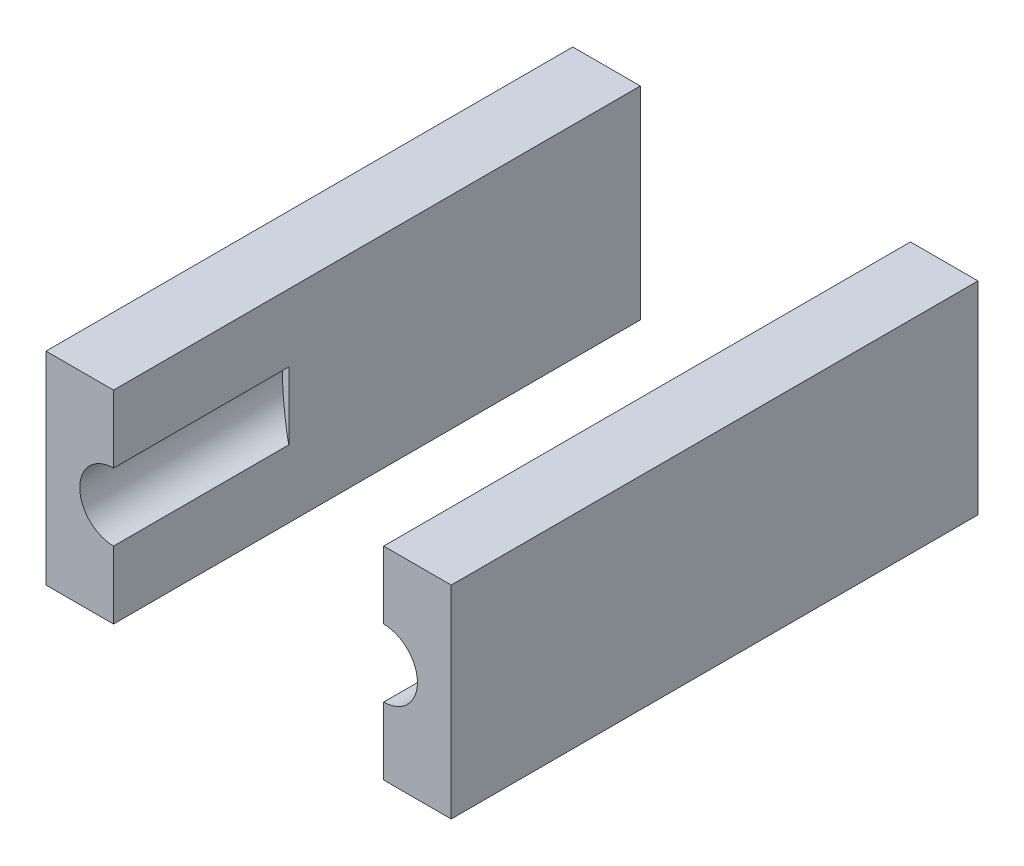
ISO-10303-21;
HEADER;
FILE_DESCRIPTION(('STEP AP214'),'2;1');
FILE_NAME('part.step','',(''),(''),'','','');
FILE_SCHEMA(('AUTOMOTIVE_DESIGN { 1 0 10303 214 1 1 1 1 }'));
ENDSEC;
DATA;
#1=APPLICATION_CONTEXT('core data for automotive mechanical design processes');
#2=APPLICATION_PROTOCOL_DEFINITION('international standard','automotive_design',2000,#1);
#3=PRODUCT_CONTEXT('',#1,'mechanical');
#4=PRODUCT('Part','Part','',(#3));
#5=PRODUCT_RELATED_PRODUCT_CATEGORY('part','',(#4));
#6=PRODUCT_DEFINITION_FORMATION('','',#4);
#7=PRODUCT_DEFINITION_CONTEXT('part definition',#1,'design');
#8=PRODUCT_DEFINITION('design','',#6,#7);
#9=PRODUCT_DEFINITION_SHAPE('','',#8);
#10=(LENGTH_UNIT() NAMED_UNIT(*) SI_UNIT(.MILLI.,.METRE.));
#11=(NAMED_UNIT(*) PLANE_ANGLE_UNIT() SI_UNIT($,.RADIAN.));
#12=(NAMED_UNIT(*) SI_UNIT($,.STERADIAN.) SOLID_ANGLE_UNIT());
#13=UNCERTAINTY_MEASURE_WITH_UNIT(LENGTH_MEASURE(1.E-05),#10,'distance_accuracy_value','');
#14=(GEOMETRIC_REPRESENTATION_CONTEXT(3) GLOBAL_UNCERTAINTY_ASSIGNED_CONTEXT((#13)) GLOBAL_UNIT_ASSIGNED_CONTEXT((#10,
#11,#12)) REPRESENTATION_CONTEXT('',''));
#15=CARTESIAN_POINT('',(0.,0.,0.));
#16=DIRECTION('',(0.,0.,1.));
#17=DIRECTION('',(1.,0.,0.));
#18=AXIS2_PLACEMENT_3D('',#15,#16,#17);
#19=CARTESIAN_POINT('',(20.,15.,-109.622738716799));
#20=DIRECTION('',(-1.,0.,0.));
#21=DIRECTION('',(0.,-1.,0.));
#22=AXIS2_PLACEMENT_3D('',#19,#20,#21);
#23=PLANE('',#22);
#24=DIRECTION('',(0.,0.,-1.));
#25=VECTOR('',#24,1.);
#26=CARTESIAN_POINT('',(20.,5.,0.));
#27=LINE('',#26,#25);
#28=CARTESIAN_POINT('',(20.,5.,-25.9580398915498));
#29=VERTEX_POINT('',#28);
#30=CARTESIAN_POINT('',(20.,5.,0.));
#31=VERTEX_POINT('',#30);
#32=EDGE_CURVE('E172',#29,#31,#27,.F.);
#33=ORIENTED_EDGE('',*,*,#32,.T.);
#34=DIRECTION('',(0.,-1.,0.));
#35=VECTOR('',#34,1.);
#36=CARTESIAN_POINT('',(20.,15.,0.));
#37=LINE('',#36,#35);
#38=CARTESIAN_POINT('',(20.,15.,0.));
#39=VERTEX_POINT('',#38);
#40=EDGE_CURVE('E129',#39,#31,#37,.T.);
#41=ORIENTED_EDGE('',*,*,#40,.F.);
#42=DIRECTION('',(0.,0.,1.));
#43=VECTOR('',#42,1.);
#44=CARTESIAN_POINT('',(20.,15.,-109.622738716799));
#45=LINE('',#44,#43);
#46=CARTESIAN_POINT('',(20.,15.,-77.9999621151153));
#47=VERTEX_POINT('',#46);
#48=EDGE_CURVE('E57',#47,#39,#45,.T.);
#49=ORIENTED_EDGE('',*,*,#48,.F.);
#50=DIRECTION('',(0.,1.,0.));
#51=VECTOR('',#50,1.);
#52=CARTESIAN_POINT('',(20.,15.,-77.9999621151153));
#53=LINE('',#52,#51);
#54=CARTESIAN_POINT('',(20.,-15.,-77.9999621151153));
#55=VERTEX_POINT('',#54);
#56=EDGE_CURVE('E110',#55,#47,#53,.T.);
#57=ORIENTED_EDGE('',*,*,#56,.F.);
#58=DIRECTION('',(0.,0.,1.));
#59=VECTOR('',#58,1.);
#60=CARTESIAN_POINT('',(20.,-15.,-109.622738716799));
#61=LINE('',#60,#59);
#62=CARTESIAN_POINT('',(20.,-15.,0.));
#63=VERTEX_POINT('',#62);
#64=EDGE_CURVE('E96',#55,#63,#61,.T.);
#65=ORIENTED_EDGE('',*,*,#64,.T.);
#66=CARTESIAN_POINT('',(20.,-5.,0.));
#67=VERTEX_POINT('',#66);
#68=EDGE_CURVE('E132',#67,#63,#37,.T.);
#69=ORIENTED_EDGE('',*,*,#68,.F.);
#70=DIRECTION('',(0.,0.,-1.));
#71=VECTOR('',#70,1.);
#72=CARTESIAN_POINT('',(20.,-5.,0.));
#73=LINE('',#72,#71);
#74=CARTESIAN_POINT('',(20.,-5.,-25.9580398915498));
#75=VERTEX_POINT('',#74);
#76=EDGE_CURVE('E64',#67,#75,#73,.T.);
#77=ORIENTED_EDGE('',*,*,#76,.T.);
#78=DIRECTION('',(0.,1.,0.));
#79=VECTOR('',#78,1.);
#80=CARTESIAN_POINT('',(20.,15.,-25.9580398915498));
#81=LINE('',#80,#79);
#82=EDGE_CURVE('E12',#75,#29,#81,.T.);
#83=ORIENTED_EDGE('',*,*,#82,.T.);
#84=EDGE_LOOP('',(#33,#41,#49,#57,#65,#69,#77,#83));
#85=FACE_BOUND('',#84,.T.);
#86=ADVANCED_FACE('F49',(#85),#23,.T.);
#87=CARTESIAN_POINT('',(30.,15.,-109.622738716799));
#88=DIRECTION('',(0.,1.,0.));
#89=DIRECTION('',(-1.,0.,0.));
#90=AXIS2_PLACEMENT_3D('',#87,#88,#89);
#91=PLANE('',#90);
#92=DIRECTION('',(1.,0.,0.));
#93=VECTOR('',#92,1.);
#94=CARTESIAN_POINT('',(30.,15.,-77.9999621151153));
#95=LINE('',#94,#93);
#96=CARTESIAN_POINT('',(30.,15.,-77.9999621151153));
#97=VERTEX_POINT('',#96);
#98=EDGE_CURVE('E115',#47,#97,#95,.T.);
#99=ORIENTED_EDGE('',*,*,#98,.F.);
#100=ORIENTED_EDGE('',*,*,#48,.T.);
#101=DIRECTION('',(-1.,0.,0.));
#102=VECTOR('',#101,1.);
#103=CARTESIAN_POINT('',(30.,15.,0.));
#104=LINE('',#103,#102);
#105=CARTESIAN_POINT('',(30.,15.,0.));
#106=VERTEX_POINT('',#105);
#107=EDGE_CURVE('E107',#106,#39,#104,.T.);
#108=ORIENTED_EDGE('',*,*,#107,.F.);
#109=DIRECTION('',(0.,0.,1.));
#110=VECTOR('',#109,1.);
#111=CARTESIAN_POINT('',(30.,15.,-109.622738716799));
#112=LINE('',#111,#110);
#113=EDGE_CURVE('E120',#97,#106,#112,.T.);
#114=ORIENTED_EDGE('',*,*,#113,.F.);
#115=EDGE_LOOP('',(#99,#100,#108,#114));
#116=FACE_BOUND('',#115,.T.);
#117=ADVANCED_FACE('F139',(#116),#91,.T.);
#118=CARTESIAN_POINT('',(30.,15.,-109.622738716799));
#119=DIRECTION('',(1.,0.,0.));
#120=DIRECTION('',(0.,1.,0.));
#121=AXIS2_PLACEMENT_3D('',#118,#119,#120);
#122=PLANE('',#121);
#123=DIRECTION('',(0.,-1.,0.));
#124=VECTOR('',#123,1.);
#125=CARTESIAN_POINT('',(30.,-15.,-77.9999621151153));
#126=LINE('',#125,#124);
#127=CARTESIAN_POINT('',(30.,-15.,-77.9999621151153));
#128=VERTEX_POINT('',#127);
#129=EDGE_CURVE('E119',#97,#128,#126,.T.);
#130=ORIENTED_EDGE('',*,*,#129,.F.);
#131=ORIENTED_EDGE('',*,*,#113,.T.);
#132=DIRECTION('',(0.,1.,0.));
#133=VECTOR('',#132,1.);
#134=CARTESIAN_POINT('',(30.,15.,0.));
#135=LINE('',#134,#133);
#136=CARTESIAN_POINT('',(30.,-15.,0.));
#137=VERTEX_POINT('',#136);
#138=EDGE_CURVE('E114',#137,#106,#135,.T.);
#139=ORIENTED_EDGE('',*,*,#138,.F.);
#140=DIRECTION('',(0.,0.,1.));
#141=VECTOR('',#140,1.);
#142=CARTESIAN_POINT('',(30.,-15.,-109.622738716799));
#143=LINE('',#142,#141);
#144=EDGE_CURVE('E106',#128,#137,#143,.T.);
#145=ORIENTED_EDGE('',*,*,#144,.F.);
#146=EDGE_LOOP('',(#130,#131,#139,#145));
#147=FACE_BOUND('',#146,.T.);
#148=ADVANCED_FACE('F137',(#147),#122,.T.);
#149=CARTESIAN_POINT('',(30.,-15.,-109.622738716799));
#150=DIRECTION('',(0.,-1.,0.));
#151=DIRECTION('',(1.,0.,0.));
#152=AXIS2_PLACEMENT_3D('',#149,#150,#151);
#153=PLANE('',#152);
#154=DIRECTION('',(1.,0.,0.));
#155=VECTOR('',#154,1.);
#156=CARTESIAN_POINT('',(30.,-15.,-77.9999621151153));
#157=LINE('',#156,#155);
#158=EDGE_CURVE('E100',#55,#128,#157,.T.);
#159=ORIENTED_EDGE('',*,*,#158,.T.);
#160=ORIENTED_EDGE('',*,*,#144,.T.);
#161=DIRECTION('',(1.,0.,0.));
#162=VECTOR('',#161,1.);
#163=CARTESIAN_POINT('',(30.,-15.,0.));
#164=LINE('',#163,#162);
#165=EDGE_CURVE('E103',#63,#137,#164,.T.);
#166=ORIENTED_EDGE('',*,*,#165,.F.);
#167=ORIENTED_EDGE('',*,*,#64,.F.);
#168=EDGE_LOOP('',(#159,#160,#166,#167));
#169=FACE_BOUND('',#168,.T.);
#170=ADVANCED_FACE('F98',(#169),#153,.T.);
#171=CARTESIAN_POINT('',(0.,0.,0.));
#172=DIRECTION('',(0.,0.,1.));
#173=DIRECTION('',(1.,0.,0.));
#174=AXIS2_PLACEMENT_3D('',#171,#172,#173);
#175=PLANE('',#174);
#176=ORIENTED_EDGE('',*,*,#40,.T.);
#177=CARTESIAN_POINT('',(20.,0.,0.));
#178=DIRECTION('',(0.,0.,1.));
#179=DIRECTION('',(-1.,0.,0.));
#180=AXIS2_PLACEMENT_3D('',#177,#178,#179);
#181=CIRCLE('',#180,5.);
#182=EDGE_CURVE('E176',#67,#31,#181,.T.);
#183=ORIENTED_EDGE('',*,*,#182,.F.);
#184=ORIENTED_EDGE('',*,*,#68,.T.);
#185=ORIENTED_EDGE('',*,*,#165,.T.);
#186=ORIENTED_EDGE('',*,*,#138,.T.);
#187=ORIENTED_EDGE('',*,*,#107,.T.);
#188=EDGE_LOOP('',(#176,#183,#184,#185,#186,#187));
#189=FACE_BOUND('',#188,.T.);
#190=ADVANCED_FACE('F51',(#189),#175,.T.);
#191=CARTESIAN_POINT('',(-20.,0.,-77.9999621151153));
#192=DIRECTION('',(0.,0.,1.));
#193=DIRECTION('',(0.,1.,0.));
#194=AXIS2_PLACEMENT_3D('',#191,#192,#193);
#195=PLANE('',#194);
#196=ORIENTED_EDGE('',*,*,#158,.F.);
#197=ORIENTED_EDGE('',*,*,#56,.T.);
#198=ORIENTED_EDGE('',*,*,#98,.T.);
#199=ORIENTED_EDGE('',*,*,#129,.T.);
#200=EDGE_LOOP('',(#196,#197,#198,#199));
#201=FACE_BOUND('',#200,.T.);
#202=ADVANCED_FACE('F118',(#201),#195,.F.);
#203=CARTESIAN_POINT('',(20.,0.,0.));
#204=DIRECTION('',(0.,0.,-1.));
#205=DIRECTION('',(1.,0.,0.));
#206=AXIS2_PLACEMENT_3D('',#203,#204,#205);
#207=CYLINDRICAL_SURFACE('',#206,5.);
#208=CARTESIAN_POINT('',(20.,0.,-25.9580398915498));
#209=DIRECTION('',(0.628666366380632,0.,0.777675124831554));
#210=DIRECTION('',(0.777675124831554,0.,-0.628666366380632));
#211=AXIS2_PLACEMENT_3D('',#208,#209,#210);
#212=ELLIPSE('',#211,6.42941999859261,5.);
#213=EDGE_CURVE('E170',#75,#29,#212,.T.);
#214=ORIENTED_EDGE('',*,*,#213,.F.);
#215=ORIENTED_EDGE('',*,*,#76,.F.);
#216=ORIENTED_EDGE('',*,*,#182,.T.);
#217=ORIENTED_EDGE('',*,*,#32,.F.);
#218=EDGE_LOOP('',(#214,#215,#216,#217));
#219=FACE_BOUND('',#218,.T.);
#220=ADVANCED_FACE('F157',(#219),#207,.F.);
#221=CARTESIAN_POINT('',(25.,5.,-30.));
#222=DIRECTION('',(0.628666366380632,0.,0.777675124831554));
#223=DIRECTION('',(-0.777675124831554,0.,0.628666366380632));
#224=AXIS2_PLACEMENT_3D('',#221,#222,#223);
#225=PLANE('',#224);
#226=ORIENTED_EDGE('',*,*,#213,.T.);
#227=ORIENTED_EDGE('',*,*,#82,.F.);
#228=EDGE_LOOP('',(#226,#227));
#229=FACE_BOUND('',#228,.T.);
#230=ADVANCED_FACE('F161',(#229),#225,.T.);
#231=CLOSED_SHELL('',(#86,#117,#148,#170,#190,#202,#220,#230));
#232=MANIFOLD_SOLID_BREP('B2',#231);
#233=CARTESIAN_POINT('',(-20.,15.,-109.622738716799));
#234=DIRECTION('',(1.,0.,0.));
#235=DIRECTION('',(0.,1.,0.));
#236=AXIS2_PLACEMENT_3D('',#233,#234,#235);
#237=PLANE('',#236);
#238=DIRECTION('',(0.,0.,1.));
#239=VECTOR('',#238,1.);
#240=CARTESIAN_POINT('',(-20.,-5.,-30.));
#241=LINE('',#240,#239);
#242=CARTESIAN_POINT('',(-20.,-5.,-25.9580398915498));
#243=VERTEX_POINT('',#242);
#244=CARTESIAN_POINT('',(-20.,-5.,0.));
#245=VERTEX_POINT('',#244);
#246=EDGE_CURVE('E294',#243,#245,#241,.T.);
#247=ORIENTED_EDGE('',*,*,#246,.T.);
#248=DIRECTION('',(0.,1.,0.));
#249=VECTOR('',#248,1.);
#250=CARTESIAN_POINT('',(-20.,15.,0.));
#251=LINE('',#250,#249);
#252=CARTESIAN_POINT('',(-20.,-15.,0.));
#253=VERTEX_POINT('',#252);
#254=EDGE_CURVE('E296',#253,#245,#251,.T.);
#255=ORIENTED_EDGE('',*,*,#254,.F.);
#256=DIRECTION('',(0.,0.,1.));
#257=VECTOR('',#256,1.);
#258=CARTESIAN_POINT('',(-20.,-15.,-109.622738716799));
#259=LINE('',#258,#257);
#260=CARTESIAN_POINT('',(-20.,-15.,-77.9999621151153));
#261=VERTEX_POINT('',#260);
#262=EDGE_CURVE('E321',#261,#253,#259,.T.);
#263=ORIENTED_EDGE('',*,*,#262,.F.);
#264=DIRECTION('',(0.,-1.,0.));
#265=VECTOR('',#264,1.);
#266=CARTESIAN_POINT('',(-20.,15.,-77.9999621151153));
#267=LINE('',#266,#265);
#268=CARTESIAN_POINT('',(-20.,15.,-77.9999621151153));
#269=VERTEX_POINT('',#268);
#270=EDGE_CURVE('E248',#269,#261,#267,.T.);
#271=ORIENTED_EDGE('',*,*,#270,.F.);
#272=DIRECTION('',(0.,0.,1.));
#273=VECTOR('',#272,1.);
#274=CARTESIAN_POINT('',(-20.,15.,-109.622738716799));
#275=LINE('',#274,#273);
#276=CARTESIAN_POINT('',(-20.,15.,0.));
#277=VERTEX_POINT('',#276);
#278=EDGE_CURVE('E328',#269,#277,#275,.T.);
#279=ORIENTED_EDGE('',*,*,#278,.T.);
#280=CARTESIAN_POINT('',(-20.,5.,0.));
#281=VERTEX_POINT('',#280);
#282=EDGE_CURVE('E311',#281,#277,#251,.T.);
#283=ORIENTED_EDGE('',*,*,#282,.F.);
#284=DIRECTION('',(0.,0.,1.));
#285=VECTOR('',#284,1.);
#286=CARTESIAN_POINT('',(-20.,5.,-30.));
#287=LINE('',#286,#285);
#288=CARTESIAN_POINT('',(-20.,5.,-25.9580398915498));
#289=VERTEX_POINT('',#288);
#290=EDGE_CURVE('E255',#281,#289,#287,.F.);
#291=ORIENTED_EDGE('',*,*,#290,.T.);
#292=DIRECTION('',(0.,-1.,0.));
#293=VECTOR('',#292,1.);
#294=CARTESIAN_POINT('',(-20.,15.,-25.9580398915498));
#295=LINE('',#294,#293);
#296=EDGE_CURVE('E47',#289,#243,#295,.T.);
#297=ORIENTED_EDGE('',*,*,#296,.T.);
#298=EDGE_LOOP('',(#247,#255,#263,#271,#279,#283,#291,#297));
#299=FACE_BOUND('',#298,.T.);
#300=ADVANCED_FACE('F240',(#299),#237,.T.);
#301=CARTESIAN_POINT('',(-30.,15.,-109.622738716799));
#302=DIRECTION('',(-1.,0.,0.));
#303=DIRECTION('',(0.,0.,1.));
#304=AXIS2_PLACEMENT_3D('',#301,#302,#303);
#305=PLANE('',#304);
#306=DIRECTION('',(0.,-1.,0.));
#307=VECTOR('',#306,1.);
#308=CARTESIAN_POINT('',(-30.,-15.,-77.9999621151153));
#309=LINE('',#308,#307);
#310=CARTESIAN_POINT('',(-30.,15.,-77.9999621151153));
#311=VERTEX_POINT('',#310);
#312=CARTESIAN_POINT('',(-30.,-15.,-77.9999621151153));
#313=VERTEX_POINT('',#312);
#314=EDGE_CURVE('E324',#311,#313,#309,.T.);
#315=ORIENTED_EDGE('',*,*,#314,.T.);
#316=DIRECTION('',(0.,0.,1.));
#317=VECTOR('',#316,1.);
#318=CARTESIAN_POINT('',(-30.,-15.,-109.622738716799));
#319=LINE('',#318,#317);
#320=CARTESIAN_POINT('',(-30.,-15.,0.));
#321=VERTEX_POINT('',#320);
#322=EDGE_CURVE('E263',#313,#321,#319,.T.);
#323=ORIENTED_EDGE('',*,*,#322,.T.);
#324=DIRECTION('',(0.,-1.,0.));
#325=VECTOR('',#324,1.);
#326=CARTESIAN_POINT('',(-30.,15.,0.));
#327=LINE('',#326,#325);
#328=CARTESIAN_POINT('',(-30.,15.,0.));
#329=VERTEX_POINT('',#328);
#330=EDGE_CURVE('E319',#329,#321,#327,.T.);
#331=ORIENTED_EDGE('',*,*,#330,.F.);
#332=DIRECTION('',(0.,0.,1.));
#333=VECTOR('',#332,1.);
#334=CARTESIAN_POINT('',(-30.,15.,-109.622738716799));
#335=LINE('',#334,#333);
#336=EDGE_CURVE('E331',#311,#329,#335,.T.);
#337=ORIENTED_EDGE('',*,*,#336,.F.);
#338=EDGE_LOOP('',(#315,#323,#331,#337));
#339=FACE_BOUND('',#338,.T.);
#340=ADVANCED_FACE('F337',(#339),#305,.T.);
#341=CARTESIAN_POINT('',(-30.,15.,-109.622738716799));
#342=DIRECTION('',(0.,1.,0.));
#343=DIRECTION('',(-1.,0.,0.));
#344=AXIS2_PLACEMENT_3D('',#341,#342,#343);
#345=PLANE('',#344);
#346=DIRECTION('',(1.,0.,0.));
#347=VECTOR('',#346,1.);
#348=CARTESIAN_POINT('',(30.,15.,-77.9999621151153));
#349=LINE('',#348,#347);
#350=EDGE_CURVE('E314',#311,#269,#349,.T.);
#351=ORIENTED_EDGE('',*,*,#350,.F.);
#352=ORIENTED_EDGE('',*,*,#336,.T.);
#353=DIRECTION('',(-1.,0.,0.));
#354=VECTOR('',#353,1.);
#355=CARTESIAN_POINT('',(-30.,15.,0.));
#356=LINE('',#355,#354);
#357=EDGE_CURVE('E310',#277,#329,#356,.T.);
#358=ORIENTED_EDGE('',*,*,#357,.F.);
#359=ORIENTED_EDGE('',*,*,#278,.F.);
#360=EDGE_LOOP('',(#351,#352,#358,#359));
#361=FACE_BOUND('',#360,.T.);
#362=ADVANCED_FACE('F345',(#361),#345,.T.);
#363=CARTESIAN_POINT('',(-30.,-15.,-109.622738716799));
#364=DIRECTION('',(0.,-1.,0.));
#365=DIRECTION('',(1.,0.,0.));
#366=AXIS2_PLACEMENT_3D('',#363,#364,#365);
#367=PLANE('',#366);
#368=DIRECTION('',(1.,0.,0.));
#369=VECTOR('',#368,1.);
#370=CARTESIAN_POINT('',(30.,-15.,-77.9999621151153));
#371=LINE('',#370,#369);
#372=EDGE_CURVE('E326',#313,#261,#371,.T.);
#373=ORIENTED_EDGE('',*,*,#372,.T.);
#374=ORIENTED_EDGE('',*,*,#262,.T.);
#375=DIRECTION('',(1.,0.,0.));
#376=VECTOR('',#375,1.);
#377=CARTESIAN_POINT('',(-30.,-15.,0.));
#378=LINE('',#377,#376);
#379=EDGE_CURVE('E309',#321,#253,#378,.T.);
#380=ORIENTED_EDGE('',*,*,#379,.F.);
#381=ORIENTED_EDGE('',*,*,#322,.F.);
#382=EDGE_LOOP('',(#373,#374,#380,#381));
#383=FACE_BOUND('',#382,.T.);
#384=ADVANCED_FACE('F341',(#383),#367,.T.);
#385=CARTESIAN_POINT('',(0.,0.,0.));
#386=DIRECTION('',(0.,0.,1.));
#387=DIRECTION('',(1.,0.,0.));
#388=AXIS2_PLACEMENT_3D('',#385,#386,#387);
#389=PLANE('',#388);
#390=ORIENTED_EDGE('',*,*,#254,.T.);
#391=CARTESIAN_POINT('',(-20.,0.,0.));
#392=DIRECTION('',(0.,0.,-1.));
#393=DIRECTION('',(1.,0.,0.));
#394=AXIS2_PLACEMENT_3D('',#391,#392,#393);
#395=CIRCLE('',#394,5.);
#396=EDGE_CURVE('E302',#245,#281,#395,.T.);
#397=ORIENTED_EDGE('',*,*,#396,.T.);
#398=ORIENTED_EDGE('',*,*,#282,.T.);
#399=ORIENTED_EDGE('',*,*,#357,.T.);
#400=ORIENTED_EDGE('',*,*,#330,.T.);
#401=ORIENTED_EDGE('',*,*,#379,.T.);
#402=EDGE_LOOP('',(#390,#397,#398,#399,#400,#401));
#403=FACE_BOUND('',#402,.T.);
#404=ADVANCED_FACE('F307',(#403),#389,.T.);
#405=CARTESIAN_POINT('',(-20.,0.,-77.9999621151153));
#406=DIRECTION('',(0.,0.,1.));
#407=DIRECTION('',(0.,1.,0.));
#408=AXIS2_PLACEMENT_3D('',#405,#406,#407);
#409=PLANE('',#408);
#410=ORIENTED_EDGE('',*,*,#350,.T.);
#411=ORIENTED_EDGE('',*,*,#270,.T.);
#412=ORIENTED_EDGE('',*,*,#372,.F.);
#413=ORIENTED_EDGE('',*,*,#314,.F.);
#414=EDGE_LOOP('',(#410,#411,#412,#413));
#415=FACE_BOUND('',#414,.T.);
#416=ADVANCED_FACE('F242',(#415),#409,.F.);
#417=CARTESIAN_POINT('',(-20.,0.,-30.));
#418=DIRECTION('',(0.,0.,1.));
#419=DIRECTION('',(-1.,0.,0.));
#420=AXIS2_PLACEMENT_3D('',#417,#418,#419);
#421=CYLINDRICAL_SURFACE('',#420,5.);
#422=ORIENTED_EDGE('',*,*,#396,.F.);
#423=ORIENTED_EDGE('',*,*,#246,.F.);
#424=CARTESIAN_POINT('',(-20.,0.,-25.9580398915498));
#425=DIRECTION('',(-0.628666366380632,0.,0.777675124831554));
#426=DIRECTION('',(0.777675124831554,0.,0.628666366380632));
#427=AXIS2_PLACEMENT_3D('',#424,#425,#426);
#428=ELLIPSE('',#427,6.42941999859261,5.);
#429=EDGE_CURVE('E300',#289,#243,#428,.T.);
#430=ORIENTED_EDGE('',*,*,#429,.F.);
#431=ORIENTED_EDGE('',*,*,#290,.F.);
#432=EDGE_LOOP('',(#422,#423,#430,#431));
#433=FACE_BOUND('',#432,.T.);
#434=ADVANCED_FACE('F303',(#433),#421,.F.);
#435=CARTESIAN_POINT('',(-25.,5.,-30.));
#436=DIRECTION('',(-0.628666366380632,0.,0.777675124831554));
#437=DIRECTION('',(-0.777675124831554,0.,-0.628666366380632));
#438=AXIS2_PLACEMENT_3D('',#435,#436,#437);
#439=PLANE('',#438);
#440=ORIENTED_EDGE('',*,*,#429,.T.);
#441=ORIENTED_EDGE('',*,*,#296,.F.);
#442=EDGE_LOOP('',(#440,#441));
#443=FACE_BOUND('',#442,.T.);
#444=ADVANCED_FACE('F348',(#443),#439,.T.);
#445=CLOSED_SHELL('',(#300,#340,#362,#384,#404,#416,#434,#444));
#446=MANIFOLD_SOLID_BREP('B6',#445);
#447=ADVANCED_BREP_SHAPE_REPRESENTATION('',(#18,#232,#446),#14);
#448=SHAPE_DEFINITION_REPRESENTATION(#9,#447);
ENDSEC;
END-ISO-10303-21;
